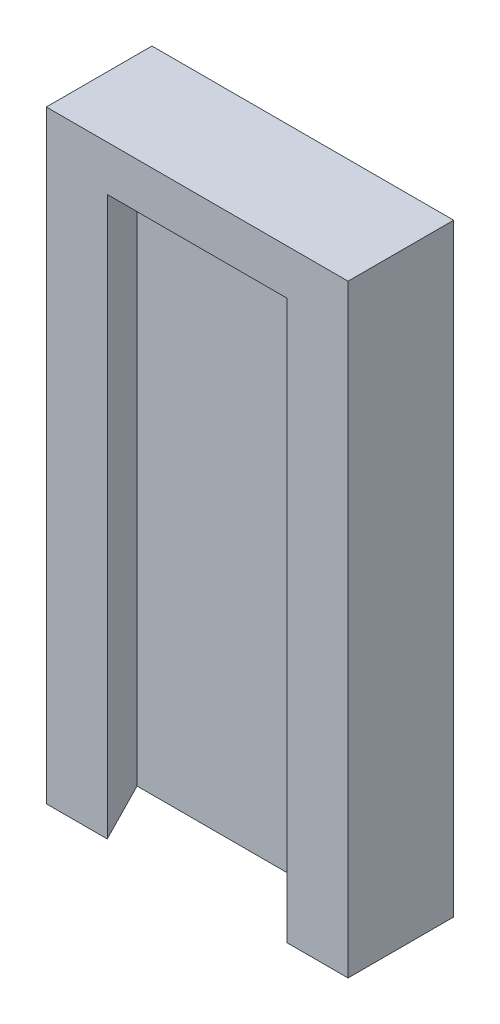
ISO-10303-21;
HEADER;
FILE_DESCRIPTION(('STEP AP214'),'2;1');
FILE_NAME('part.step','',(''),(''),'','','');
FILE_SCHEMA(('AUTOMOTIVE_DESIGN { 1 0 10303 214 1 1 1 1 }'));
ENDSEC;
DATA;
#1=APPLICATION_CONTEXT('core data for automotive mechanical design processes');
#2=APPLICATION_PROTOCOL_DEFINITION('international standard','automotive_design',2000,#1);
#3=PRODUCT_CONTEXT('',#1,'mechanical');
#4=PRODUCT('Part','Part','',(#3));
#5=PRODUCT_RELATED_PRODUCT_CATEGORY('part','',(#4));
#6=PRODUCT_DEFINITION_FORMATION('','',#4);
#7=PRODUCT_DEFINITION_CONTEXT('part definition',#1,'design');
#8=PRODUCT_DEFINITION('design','',#6,#7);
#9=PRODUCT_DEFINITION_SHAPE('','',#8);
#10=(LENGTH_UNIT() NAMED_UNIT(*) SI_UNIT(.MILLI.,.METRE.));
#11=(NAMED_UNIT(*) PLANE_ANGLE_UNIT() SI_UNIT($,.RADIAN.));
#12=(NAMED_UNIT(*) SI_UNIT($,.STERADIAN.) SOLID_ANGLE_UNIT());
#13=UNCERTAINTY_MEASURE_WITH_UNIT(LENGTH_MEASURE(1.E-05),#10,'distance_accuracy_value','');
#14=(GEOMETRIC_REPRESENTATION_CONTEXT(3) GLOBAL_UNCERTAINTY_ASSIGNED_CONTEXT((#13)) GLOBAL_UNIT_ASSIGNED_CONTEXT((#10,
#11,#12)) REPRESENTATION_CONTEXT('',''));
#15=CARTESIAN_POINT('',(0.,0.,0.));
#16=DIRECTION('',(0.,0.,1.));
#17=DIRECTION('',(1.,0.,0.));
#18=AXIS2_PLACEMENT_3D('',#15,#16,#17);
#19=CARTESIAN_POINT('',(20.,40.,7.));
#20=DIRECTION('',(-1.,0.,0.));
#21=DIRECTION('',(0.,0.,1.));
#22=AXIS2_PLACEMENT_3D('',#19,#20,#21);
#23=PLANE('',#22);
#24=DIRECTION('',(0.,0.,-1.));
#25=VECTOR('',#24,1.);
#26=CARTESIAN_POINT('',(20.,-40.,7.));
#27=LINE('',#26,#25);
#28=CARTESIAN_POINT('',(20.,-40.,7.));
#29=VERTEX_POINT('',#28);
#30=CARTESIAN_POINT('',(20.,-40.,-7.));
#31=VERTEX_POINT('',#30);
#32=EDGE_CURVE('E124',#29,#31,#27,.T.);
#33=ORIENTED_EDGE('',*,*,#32,.T.);
#34=DIRECTION('',(0.,-1.,0.));
#35=VECTOR('',#34,1.);
#36=CARTESIAN_POINT('',(20.,40.,-7.));
#37=LINE('',#36,#35);
#38=CARTESIAN_POINT('',(20.,40.,-7.));
#39=VERTEX_POINT('',#38);
#40=EDGE_CURVE('E11',#39,#31,#37,.T.);
#41=ORIENTED_EDGE('',*,*,#40,.F.);
#42=DIRECTION('',(0.,0.,-1.));
#43=VECTOR('',#42,1.);
#44=CARTESIAN_POINT('',(20.,40.,7.));
#45=LINE('',#44,#43);
#46=CARTESIAN_POINT('',(20.,40.,7.));
#47=VERTEX_POINT('',#46);
#48=EDGE_CURVE('E129',#47,#39,#45,.T.);
#49=ORIENTED_EDGE('',*,*,#48,.F.);
#50=DIRECTION('',(0.,-1.,0.));
#51=VECTOR('',#50,1.);
#52=CARTESIAN_POINT('',(20.,40.,7.));
#53=LINE('',#52,#51);
#54=EDGE_CURVE('E134',#47,#29,#53,.T.);
#55=ORIENTED_EDGE('',*,*,#54,.T.);
#56=EDGE_LOOP('',(#33,#41,#49,#55));
#57=FACE_BOUND('',#56,.T.);
#58=ADVANCED_FACE('F33',(#57),#23,.F.);
#59=CARTESIAN_POINT('',(-20.,40.,-7.));
#60=DIRECTION('',(0.,0.,1.));
#61=DIRECTION('',(1.,0.,0.));
#62=AXIS2_PLACEMENT_3D('',#59,#60,#61);
#63=PLANE('',#62);
#64=DIRECTION('',(-1.,0.,0.));
#65=VECTOR('',#64,1.);
#66=CARTESIAN_POINT('',(-20.,-40.,-7.));
#67=LINE('',#66,#65);
#68=CARTESIAN_POINT('',(-20.,-40.,-7.));
#69=VERTEX_POINT('',#68);
#70=EDGE_CURVE('E130',#31,#69,#67,.T.);
#71=ORIENTED_EDGE('',*,*,#70,.T.);
#72=DIRECTION('',(0.,-1.,0.));
#73=VECTOR('',#72,1.);
#74=CARTESIAN_POINT('',(-20.,40.,-7.));
#75=LINE('',#74,#73);
#76=CARTESIAN_POINT('',(-20.,40.,-7.));
#77=VERTEX_POINT('',#76);
#78=EDGE_CURVE('E40',#77,#69,#75,.T.);
#79=ORIENTED_EDGE('',*,*,#78,.F.);
#80=DIRECTION('',(-1.,0.,0.));
#81=VECTOR('',#80,1.);
#82=CARTESIAN_POINT('',(-20.,40.,-7.));
#83=LINE('',#82,#81);
#84=EDGE_CURVE('E84',#39,#77,#83,.T.);
#85=ORIENTED_EDGE('',*,*,#84,.F.);
#86=ORIENTED_EDGE('',*,*,#40,.T.);
#87=EDGE_LOOP('',(#71,#79,#85,#86));
#88=FACE_BOUND('',#87,.T.);
#89=ADVANCED_FACE('F152',(#88),#63,.F.);
#90=CARTESIAN_POINT('',(-20.,40.,7.));
#91=DIRECTION('',(1.,0.,0.));
#92=DIRECTION('',(0.,0.,-1.));
#93=AXIS2_PLACEMENT_3D('',#90,#91,#92);
#94=PLANE('',#93);
#95=DIRECTION('',(0.,0.,1.));
#96=VECTOR('',#95,1.);
#97=CARTESIAN_POINT('',(-20.,-40.,7.));
#98=LINE('',#97,#96);
#99=CARTESIAN_POINT('',(-20.,-40.,7.));
#100=VERTEX_POINT('',#99);
#101=EDGE_CURVE('E126',#69,#100,#98,.T.);
#102=ORIENTED_EDGE('',*,*,#101,.T.);
#103=DIRECTION('',(0.,-1.,0.));
#104=VECTOR('',#103,1.);
#105=CARTESIAN_POINT('',(-20.,40.,7.));
#106=LINE('',#105,#104);
#107=CARTESIAN_POINT('',(-20.,40.,7.));
#108=VERTEX_POINT('',#107);
#109=EDGE_CURVE('E136',#108,#100,#106,.T.);
#110=ORIENTED_EDGE('',*,*,#109,.F.);
#111=DIRECTION('',(0.,0.,1.));
#112=VECTOR('',#111,1.);
#113=CARTESIAN_POINT('',(-20.,40.,7.));
#114=LINE('',#113,#112);
#115=EDGE_CURVE('E144',#77,#108,#114,.T.);
#116=ORIENTED_EDGE('',*,*,#115,.F.);
#117=ORIENTED_EDGE('',*,*,#78,.T.);
#118=EDGE_LOOP('',(#102,#110,#116,#117));
#119=FACE_BOUND('',#118,.T.);
#120=ADVANCED_FACE('F142',(#119),#94,.F.);
#121=CARTESIAN_POINT('',(-20.,40.,7.));
#122=DIRECTION('',(0.,0.,-1.));
#123=DIRECTION('',(-1.,0.,0.));
#124=AXIS2_PLACEMENT_3D('',#121,#122,#123);
#125=PLANE('',#124);
#126=DIRECTION('',(1.,0.,0.));
#127=VECTOR('',#126,1.);
#128=CARTESIAN_POINT('',(-11.9233201315699,34.,7.));
#129=LINE('',#128,#127);
#130=CARTESIAN_POINT('',(-11.9233201315699,34.,7.));
#131=VERTEX_POINT('',#130);
#132=CARTESIAN_POINT('',(11.9233201315699,34.,7.));
#133=VERTEX_POINT('',#132);
#134=EDGE_CURVE('E118',#131,#133,#129,.T.);
#135=ORIENTED_EDGE('',*,*,#134,.T.);
#136=DIRECTION('',(0.,1.,0.));
#137=VECTOR('',#136,1.);
#138=CARTESIAN_POINT('',(11.9233201315699,-73.0454989370716,7.));
#139=LINE('',#138,#137);
#140=CARTESIAN_POINT('',(11.9233201315699,-40.,7.));
#141=VERTEX_POINT('',#140);
#142=EDGE_CURVE('E110',#141,#133,#139,.T.);
#143=ORIENTED_EDGE('',*,*,#142,.F.);
#144=DIRECTION('',(1.,0.,0.));
#145=VECTOR('',#144,1.);
#146=CARTESIAN_POINT('',(-20.,-40.,7.));
#147=LINE('',#146,#145);
#148=EDGE_CURVE('E77',#141,#29,#147,.T.);
#149=ORIENTED_EDGE('',*,*,#148,.T.);
#150=ORIENTED_EDGE('',*,*,#54,.F.);
#151=DIRECTION('',(1.,0.,0.));
#152=VECTOR('',#151,1.);
#153=CARTESIAN_POINT('',(-20.,40.,7.));
#154=LINE('',#153,#152);
#155=EDGE_CURVE('E56',#108,#47,#154,.T.);
#156=ORIENTED_EDGE('',*,*,#155,.F.);
#157=ORIENTED_EDGE('',*,*,#109,.T.);
#158=CARTESIAN_POINT('',(-11.9233201315699,-40.,7.));
#159=VERTEX_POINT('',#158);
#160=EDGE_CURVE('E125',#100,#159,#147,.T.);
#161=ORIENTED_EDGE('',*,*,#160,.T.);
#162=DIRECTION('',(0.,1.,0.));
#163=VECTOR('',#162,1.);
#164=CARTESIAN_POINT('',(-11.9233201315699,-73.0454989370716,7.));
#165=LINE('',#164,#163);
#166=EDGE_CURVE('E47',#159,#131,#165,.T.);
#167=ORIENTED_EDGE('',*,*,#166,.T.);
#168=EDGE_LOOP('',(#135,#143,#149,#150,#156,#157,#161,#167));
#169=FACE_BOUND('',#168,.T.);
#170=ADVANCED_FACE('F117',(#169),#125,.F.);
#171=CARTESIAN_POINT('',(0.,40.,0.));
#172=DIRECTION('',(0.,-1.,0.));
#173=DIRECTION('',(0.,0.,-1.));
#174=AXIS2_PLACEMENT_3D('',#171,#172,#173);
#175=PLANE('',#174);
#176=ORIENTED_EDGE('',*,*,#48,.T.);
#177=ORIENTED_EDGE('',*,*,#84,.T.);
#178=ORIENTED_EDGE('',*,*,#115,.T.);
#179=ORIENTED_EDGE('',*,*,#155,.T.);
#180=EDGE_LOOP('',(#176,#177,#178,#179));
#181=FACE_BOUND('',#180,.T.);
#182=ADVANCED_FACE('F196',(#181),#175,.F.);
#183=CARTESIAN_POINT('',(0.,-40.,0.));
#184=DIRECTION('',(0.,-1.,0.));
#185=DIRECTION('',(0.,0.,-1.));
#186=AXIS2_PLACEMENT_3D('',#183,#184,#185);
#187=PLANE('',#186);
#188=DIRECTION('',(0.453990499739545,0.,-0.891006524188369));
#189=VECTOR('',#188,1.);
#190=CARTESIAN_POINT('',(16.025,-40.,-1.05));
#191=LINE('',#190,#189);
#192=CARTESIAN_POINT('',(16.025,-40.,-1.05));
#193=VERTEX_POINT('',#192);
#194=EDGE_CURVE('E107',#141,#193,#191,.T.);
#195=ORIENTED_EDGE('',*,*,#194,.T.);
#196=DIRECTION('',(-1.,0.,0.));
#197=VECTOR('',#196,1.);
#198=CARTESIAN_POINT('',(-16.025,-40.,-1.05));
#199=LINE('',#198,#197);
#200=CARTESIAN_POINT('',(-16.025,-40.,-1.05));
#201=VERTEX_POINT('',#200);
#202=EDGE_CURVE('E159',#193,#201,#199,.T.);
#203=ORIENTED_EDGE('',*,*,#202,.T.);
#204=DIRECTION('',(0.453990499739545,0.,0.891006524188369));
#205=VECTOR('',#204,1.);
#206=CARTESIAN_POINT('',(-16.025,-40.,-1.05));
#207=LINE('',#206,#205);
#208=EDGE_CURVE('E146',#201,#159,#207,.T.);
#209=ORIENTED_EDGE('',*,*,#208,.T.);
#210=ORIENTED_EDGE('',*,*,#160,.F.);
#211=ORIENTED_EDGE('',*,*,#101,.F.);
#212=ORIENTED_EDGE('',*,*,#70,.F.);
#213=ORIENTED_EDGE('',*,*,#32,.F.);
#214=ORIENTED_EDGE('',*,*,#148,.F.);
#215=EDGE_LOOP('',(#195,#203,#209,#210,#211,#212,#213,#214));
#216=FACE_BOUND('',#215,.T.);
#217=ADVANCED_FACE('F122',(#216),#187,.T.);
#218=CARTESIAN_POINT('',(0.,34.,0.));
#219=DIRECTION('',(0.,1.,0.));
#220=DIRECTION('',(0.,0.,1.));
#221=AXIS2_PLACEMENT_3D('',#218,#219,#220);
#222=PLANE('',#221);
#223=DIRECTION('',(0.453990499739544,0.,0.891006524188369));
#224=VECTOR('',#223,1.);
#225=CARTESIAN_POINT('',(-16.025,34.,-1.05));
#226=LINE('',#225,#224);
#227=CARTESIAN_POINT('',(-16.025,34.,-1.05));
#228=VERTEX_POINT('',#227);
#229=EDGE_CURVE('E164',#228,#131,#226,.T.);
#230=ORIENTED_EDGE('',*,*,#229,.F.);
#231=DIRECTION('',(-1.,0.,0.));
#232=VECTOR('',#231,1.);
#233=CARTESIAN_POINT('',(-16.025,34.,-1.05));
#234=LINE('',#233,#232);
#235=CARTESIAN_POINT('',(16.025,34.,-1.05));
#236=VERTEX_POINT('',#235);
#237=EDGE_CURVE('E119',#236,#228,#234,.T.);
#238=ORIENTED_EDGE('',*,*,#237,.F.);
#239=DIRECTION('',(0.453990499739544,0.,-0.891006524188369));
#240=VECTOR('',#239,1.);
#241=CARTESIAN_POINT('',(16.025,34.,-1.05));
#242=LINE('',#241,#240);
#243=EDGE_CURVE('E167',#133,#236,#242,.T.);
#244=ORIENTED_EDGE('',*,*,#243,.F.);
#245=ORIENTED_EDGE('',*,*,#134,.F.);
#246=EDGE_LOOP('',(#230,#238,#244,#245));
#247=FACE_BOUND('',#246,.T.);
#248=ADVANCED_FACE('F176',(#247),#222,.F.);
#249=CARTESIAN_POINT('',(16.025,-73.0454989370716,-1.05));
#250=DIRECTION('',(0.891006524188369,0.,0.453990499739544));
#251=DIRECTION('',(0.453990499739545,0.,-0.891006524188369));
#252=AXIS2_PLACEMENT_3D('',#249,#250,#251);
#253=PLANE('',#252);
#254=ORIENTED_EDGE('',*,*,#142,.T.);
#255=ORIENTED_EDGE('',*,*,#243,.T.);
#256=DIRECTION('',(0.,1.,0.));
#257=VECTOR('',#256,1.);
#258=CARTESIAN_POINT('',(16.025,-73.0454989370716,-1.05));
#259=LINE('',#258,#257);
#260=EDGE_CURVE('E112',#193,#236,#259,.T.);
#261=ORIENTED_EDGE('',*,*,#260,.F.);
#262=ORIENTED_EDGE('',*,*,#194,.F.);
#263=EDGE_LOOP('',(#254,#255,#261,#262));
#264=FACE_BOUND('',#263,.T.);
#265=ADVANCED_FACE('F108',(#264),#253,.F.);
#266=CARTESIAN_POINT('',(-16.025,-73.0454989370716,-1.05));
#267=DIRECTION('',(0.,0.,-1.));
#268=DIRECTION('',(-1.,0.,0.));
#269=AXIS2_PLACEMENT_3D('',#266,#267,#268);
#270=PLANE('',#269);
#271=ORIENTED_EDGE('',*,*,#260,.T.);
#272=ORIENTED_EDGE('',*,*,#237,.T.);
#273=DIRECTION('',(0.,1.,0.));
#274=VECTOR('',#273,1.);
#275=CARTESIAN_POINT('',(-16.025,-73.0454989370716,-1.05));
#276=LINE('',#275,#274);
#277=EDGE_CURVE('E160',#201,#228,#276,.T.);
#278=ORIENTED_EDGE('',*,*,#277,.F.);
#279=ORIENTED_EDGE('',*,*,#202,.F.);
#280=EDGE_LOOP('',(#271,#272,#278,#279));
#281=FACE_BOUND('',#280,.T.);
#282=ADVANCED_FACE('F173',(#281),#270,.F.);
#283=CARTESIAN_POINT('',(-16.025,-73.0454989370716,-1.05));
#284=DIRECTION('',(-0.891006524188369,0.,0.453990499739544));
#285=DIRECTION('',(0.453990499739545,0.,0.891006524188369));
#286=AXIS2_PLACEMENT_3D('',#283,#284,#285);
#287=PLANE('',#286);
#288=ORIENTED_EDGE('',*,*,#277,.T.);
#289=ORIENTED_EDGE('',*,*,#229,.T.);
#290=ORIENTED_EDGE('',*,*,#166,.F.);
#291=ORIENTED_EDGE('',*,*,#208,.F.);
#292=EDGE_LOOP('',(#288,#289,#290,#291));
#293=FACE_BOUND('',#292,.T.);
#294=ADVANCED_FACE('F177',(#293),#287,.F.);
#295=CLOSED_SHELL('',(#58,#89,#120,#170,#182,#217,#248,#265,#282,#294));
#296=MANIFOLD_SOLID_BREP('B2',#295);
#297=ADVANCED_BREP_SHAPE_REPRESENTATION('',(#18,#296),#14);
#298=SHAPE_DEFINITION_REPRESENTATION(#9,#297);
ENDSEC;
END-ISO-10303-21;
